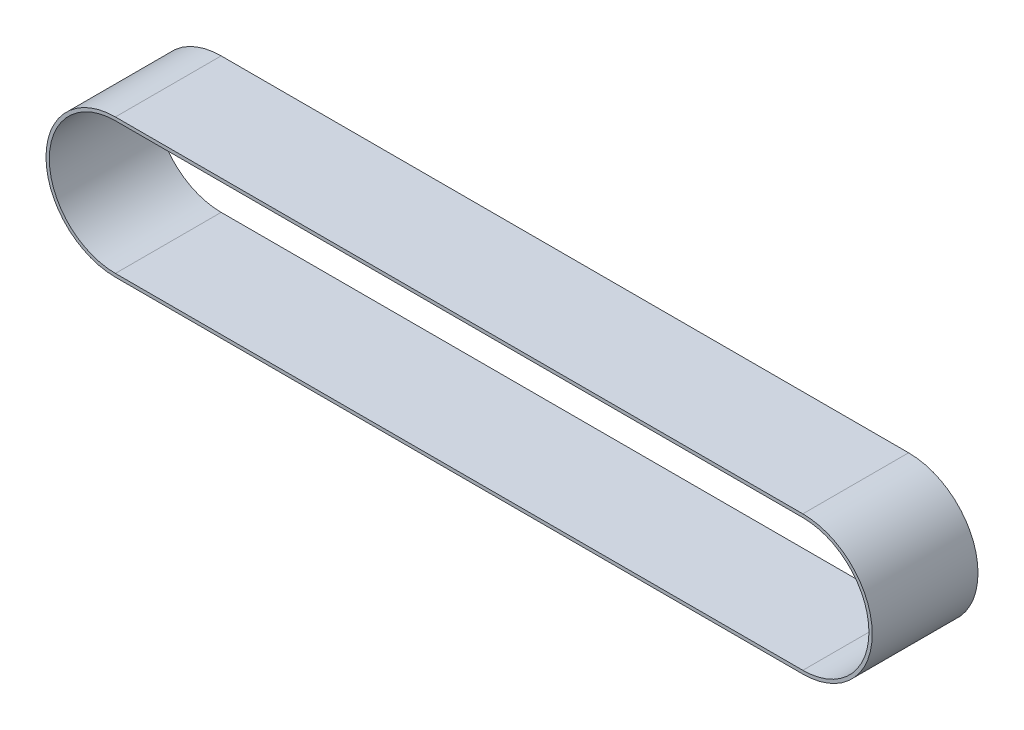
ISO-10303-21;
HEADER;
FILE_DESCRIPTION(('STEP AP214'),'2;1');
FILE_NAME('part.step','',(''),(''),'','','');
FILE_SCHEMA(('AUTOMOTIVE_DESIGN { 1 0 10303 214 1 1 1 1 }'));
ENDSEC;
DATA;
#1=APPLICATION_CONTEXT('core data for automotive mechanical design processes');
#2=APPLICATION_PROTOCOL_DEFINITION('international standard','automotive_design',2000,#1);
#3=PRODUCT_CONTEXT('',#1,'mechanical');
#4=PRODUCT('Part','Part','',(#3));
#5=PRODUCT_RELATED_PRODUCT_CATEGORY('part','',(#4));
#6=PRODUCT_DEFINITION_FORMATION('','',#4);
#7=PRODUCT_DEFINITION_CONTEXT('part definition',#1,'design');
#8=PRODUCT_DEFINITION('design','',#6,#7);
#9=PRODUCT_DEFINITION_SHAPE('','',#8);
#10=(LENGTH_UNIT() NAMED_UNIT(*) SI_UNIT(.MILLI.,.METRE.));
#11=(NAMED_UNIT(*) PLANE_ANGLE_UNIT() SI_UNIT($,.RADIAN.));
#12=(NAMED_UNIT(*) SI_UNIT($,.STERADIAN.) SOLID_ANGLE_UNIT());
#13=UNCERTAINTY_MEASURE_WITH_UNIT(LENGTH_MEASURE(1.E-05),#10,'distance_accuracy_value','');
#14=(GEOMETRIC_REPRESENTATION_CONTEXT(3) GLOBAL_UNCERTAINTY_ASSIGNED_CONTEXT((#13)) GLOBAL_UNIT_ASSIGNED_CONTEXT((#10,
#11,#12)) REPRESENTATION_CONTEXT('',''));
#15=CARTESIAN_POINT('',(0.,0.,0.));
#16=DIRECTION('',(0.,0.,1.));
#17=DIRECTION('',(1.,0.,0.));
#18=AXIS2_PLACEMENT_3D('',#15,#16,#17);
#19=CARTESIAN_POINT('',(0.,0.,50.8));
#20=DIRECTION('',(0.,0.,1.));
#21=DIRECTION('',(1.,0.,0.));
#22=AXIS2_PLACEMENT_3D('',#19,#20,#21);
#23=PLANE('',#22);
#24=CARTESIAN_POINT('',(0.,0.,50.8));
#25=DIRECTION('',(0.,0.,1.));
#26=DIRECTION('',(1.,0.,0.));
#27=AXIS2_PLACEMENT_3D('',#24,#25,#26);
#28=CIRCLE('',#27,33.3375);
#29=CARTESIAN_POINT('',(0.,33.3375,50.8));
#30=VERTEX_POINT('',#29);
#31=CARTESIAN_POINT('',(0.,-33.3375,50.8));
#32=VERTEX_POINT('',#31);
#33=EDGE_CURVE('E134',#30,#32,#28,.T.);
#34=ORIENTED_EDGE('',*,*,#33,.T.);
#35=DIRECTION('',(1.,0.,0.));
#36=VECTOR('',#35,1.);
#37=CARTESIAN_POINT('',(0.,-33.3375,50.8));
#38=LINE('',#37,#36);
#39=CARTESIAN_POINT('',(330.2,-33.3375,50.8));
#40=VERTEX_POINT('',#39);
#41=EDGE_CURVE('E137',#32,#40,#38,.T.);
#42=ORIENTED_EDGE('',*,*,#41,.T.);
#43=CARTESIAN_POINT('',(330.2,0.,50.8));
#44=DIRECTION('',(0.,0.,1.));
#45=DIRECTION('',(1.,0.,0.));
#46=AXIS2_PLACEMENT_3D('',#43,#44,#45);
#47=CIRCLE('',#46,33.3375);
#48=CARTESIAN_POINT('',(330.2,33.3375,50.8));
#49=VERTEX_POINT('',#48);
#50=EDGE_CURVE('E140',#40,#49,#47,.T.);
#51=ORIENTED_EDGE('',*,*,#50,.T.);
#52=DIRECTION('',(-1.,0.,0.));
#53=VECTOR('',#52,1.);
#54=CARTESIAN_POINT('',(0.,33.3375,50.8));
#55=LINE('',#54,#53);
#56=EDGE_CURVE('E142',#49,#30,#55,.T.);
#57=ORIENTED_EDGE('',*,*,#56,.T.);
#58=EDGE_LOOP('',(#34,#42,#51,#57));
#59=FACE_BOUND('',#58,.T.);
#60=DIRECTION('',(1.,0.,0.));
#61=VECTOR('',#60,1.);
#62=CARTESIAN_POINT('',(0.,-31.75,50.8));
#63=LINE('',#62,#61);
#64=CARTESIAN_POINT('',(0.,-31.75,50.8));
#65=VERTEX_POINT('',#64);
#66=CARTESIAN_POINT('',(330.2,-31.75,50.8));
#67=VERTEX_POINT('',#66);
#68=EDGE_CURVE('E106',#65,#67,#63,.T.);
#69=ORIENTED_EDGE('',*,*,#68,.F.);
#70=CARTESIAN_POINT('',(0.,0.,50.8));
#71=DIRECTION('',(0.,0.,1.));
#72=DIRECTION('',(1.,0.,0.));
#73=AXIS2_PLACEMENT_3D('',#70,#71,#72);
#74=CIRCLE('',#73,31.75);
#75=CARTESIAN_POINT('',(0.,31.75,50.8));
#76=VERTEX_POINT('',#75);
#77=EDGE_CURVE('E98',#76,#65,#74,.T.);
#78=ORIENTED_EDGE('',*,*,#77,.F.);
#79=DIRECTION('',(-1.,0.,0.));
#80=VECTOR('',#79,1.);
#81=CARTESIAN_POINT('',(0.,31.75,50.8));
#82=LINE('',#81,#80);
#83=CARTESIAN_POINT('',(330.2,31.75,50.8));
#84=VERTEX_POINT('',#83);
#85=EDGE_CURVE('E120',#84,#76,#82,.T.);
#86=ORIENTED_EDGE('',*,*,#85,.F.);
#87=CARTESIAN_POINT('',(330.2,0.,50.8));
#88=DIRECTION('',(0.,0.,1.));
#89=DIRECTION('',(1.,0.,0.));
#90=AXIS2_PLACEMENT_3D('',#87,#88,#89);
#91=CIRCLE('',#90,31.75);
#92=EDGE_CURVE('E118',#67,#84,#91,.T.);
#93=ORIENTED_EDGE('',*,*,#92,.F.);
#94=EDGE_LOOP('',(#69,#78,#86,#93));
#95=FACE_BOUND('',#94,.T.);
#96=ADVANCED_FACE('F33',(#59,#95),#23,.T.);
#97=CARTESIAN_POINT('',(0.,0.,0.));
#98=DIRECTION('',(0.,0.,1.));
#99=DIRECTION('',(1.,0.,0.));
#100=AXIS2_PLACEMENT_3D('',#97,#98,#99);
#101=PLANE('',#100);
#102=CARTESIAN_POINT('',(0.,0.,0.));
#103=DIRECTION('',(0.,0.,1.));
#104=DIRECTION('',(1.,0.,0.));
#105=AXIS2_PLACEMENT_3D('',#102,#103,#104);
#106=CIRCLE('',#105,33.3375);
#107=CARTESIAN_POINT('',(0.,33.3375,0.));
#108=VERTEX_POINT('',#107);
#109=CARTESIAN_POINT('',(0.,-33.3375,0.));
#110=VERTEX_POINT('',#109);
#111=EDGE_CURVE('E114',#108,#110,#106,.T.);
#112=ORIENTED_EDGE('',*,*,#111,.F.);
#113=DIRECTION('',(-1.,0.,0.));
#114=VECTOR('',#113,1.);
#115=CARTESIAN_POINT('',(0.,33.3375,0.));
#116=LINE('',#115,#114);
#117=CARTESIAN_POINT('',(330.2,33.3375,0.));
#118=VERTEX_POINT('',#117);
#119=EDGE_CURVE('E138',#118,#108,#116,.T.);
#120=ORIENTED_EDGE('',*,*,#119,.F.);
#121=CARTESIAN_POINT('',(330.2,0.,0.));
#122=DIRECTION('',(0.,0.,1.));
#123=DIRECTION('',(1.,0.,0.));
#124=AXIS2_PLACEMENT_3D('',#121,#122,#123);
#125=CIRCLE('',#124,33.3375);
#126=CARTESIAN_POINT('',(330.2,-33.3375,0.));
#127=VERTEX_POINT('',#126);
#128=EDGE_CURVE('E149',#127,#118,#125,.T.);
#129=ORIENTED_EDGE('',*,*,#128,.F.);
#130=DIRECTION('',(1.,0.,0.));
#131=VECTOR('',#130,1.);
#132=CARTESIAN_POINT('',(0.,-33.3375,0.));
#133=LINE('',#132,#131);
#134=EDGE_CURVE('E147',#110,#127,#133,.T.);
#135=ORIENTED_EDGE('',*,*,#134,.F.);
#136=EDGE_LOOP('',(#112,#120,#129,#135));
#137=FACE_BOUND('',#136,.T.);
#138=CARTESIAN_POINT('',(0.,0.,0.));
#139=DIRECTION('',(0.,0.,1.));
#140=DIRECTION('',(1.,0.,0.));
#141=AXIS2_PLACEMENT_3D('',#138,#139,#140);
#142=CIRCLE('',#141,31.75);
#143=CARTESIAN_POINT('',(0.,31.75,0.));
#144=VERTEX_POINT('',#143);
#145=CARTESIAN_POINT('',(0.,-31.75,0.));
#146=VERTEX_POINT('',#145);
#147=EDGE_CURVE('E56',#144,#146,#142,.T.);
#148=ORIENTED_EDGE('',*,*,#147,.T.);
#149=DIRECTION('',(1.,0.,0.));
#150=VECTOR('',#149,1.);
#151=CARTESIAN_POINT('',(0.,-31.75,0.));
#152=LINE('',#151,#150);
#153=CARTESIAN_POINT('',(330.2,-31.75,0.));
#154=VERTEX_POINT('',#153);
#155=EDGE_CURVE('E113',#146,#154,#152,.T.);
#156=ORIENTED_EDGE('',*,*,#155,.T.);
#157=CARTESIAN_POINT('',(330.2,0.,0.));
#158=DIRECTION('',(0.,0.,1.));
#159=DIRECTION('',(1.,0.,0.));
#160=AXIS2_PLACEMENT_3D('',#157,#158,#159);
#161=CIRCLE('',#160,31.75);
#162=CARTESIAN_POINT('',(330.2,31.75,0.));
#163=VERTEX_POINT('',#162);
#164=EDGE_CURVE('E126',#154,#163,#161,.T.);
#165=ORIENTED_EDGE('',*,*,#164,.T.);
#166=DIRECTION('',(-1.,0.,0.));
#167=VECTOR('',#166,1.);
#168=CARTESIAN_POINT('',(0.,31.75,0.));
#169=LINE('',#168,#167);
#170=EDGE_CURVE('E107',#163,#144,#169,.T.);
#171=ORIENTED_EDGE('',*,*,#170,.T.);
#172=EDGE_LOOP('',(#148,#156,#165,#171));
#173=FACE_BOUND('',#172,.T.);
#174=ADVANCED_FACE('F167',(#137,#173),#101,.F.);
#175=CARTESIAN_POINT('',(0.,0.,50.8));
#176=DIRECTION('',(0.,0.,-1.));
#177=DIRECTION('',(-1.,0.,0.));
#178=AXIS2_PLACEMENT_3D('',#175,#176,#177);
#179=CYLINDRICAL_SURFACE('',#178,33.3375);
#180=ORIENTED_EDGE('',*,*,#111,.T.);
#181=DIRECTION('',(0.,0.,-1.));
#182=VECTOR('',#181,1.);
#183=CARTESIAN_POINT('',(0.,-33.3375,50.8));
#184=LINE('',#183,#182);
#185=EDGE_CURVE('E11',#32,#110,#184,.T.);
#186=ORIENTED_EDGE('',*,*,#185,.F.);
#187=ORIENTED_EDGE('',*,*,#33,.F.);
#188=DIRECTION('',(0.,0.,-1.));
#189=VECTOR('',#188,1.);
#190=CARTESIAN_POINT('',(0.,33.3375,50.8));
#191=LINE('',#190,#189);
#192=EDGE_CURVE('E144',#30,#108,#191,.T.);
#193=ORIENTED_EDGE('',*,*,#192,.T.);
#194=EDGE_LOOP('',(#180,#186,#187,#193));
#195=FACE_BOUND('',#194,.T.);
#196=ADVANCED_FACE('F35',(#195),#179,.T.);
#197=CARTESIAN_POINT('',(0.,-33.3375,50.8));
#198=DIRECTION('',(0.,1.,0.));
#199=DIRECTION('',(0.,0.,1.));
#200=AXIS2_PLACEMENT_3D('',#197,#198,#199);
#201=PLANE('',#200);
#202=ORIENTED_EDGE('',*,*,#134,.T.);
#203=DIRECTION('',(0.,0.,-1.));
#204=VECTOR('',#203,1.);
#205=CARTESIAN_POINT('',(330.2,-33.3375,50.8));
#206=LINE('',#205,#204);
#207=EDGE_CURVE('E41',#40,#127,#206,.T.);
#208=ORIENTED_EDGE('',*,*,#207,.F.);
#209=ORIENTED_EDGE('',*,*,#41,.F.);
#210=ORIENTED_EDGE('',*,*,#185,.T.);
#211=EDGE_LOOP('',(#202,#208,#209,#210));
#212=FACE_BOUND('',#211,.T.);
#213=ADVANCED_FACE('F177',(#212),#201,.F.);
#214=CARTESIAN_POINT('',(330.2,0.,50.8));
#215=DIRECTION('',(0.,0.,-1.));
#216=DIRECTION('',(-1.,0.,0.));
#217=AXIS2_PLACEMENT_3D('',#214,#215,#216);
#218=CYLINDRICAL_SURFACE('',#217,33.3375);
#219=ORIENTED_EDGE('',*,*,#128,.T.);
#220=DIRECTION('',(0.,0.,-1.));
#221=VECTOR('',#220,1.);
#222=CARTESIAN_POINT('',(330.2,33.3375,50.8));
#223=LINE('',#222,#221);
#224=EDGE_CURVE('E154',#49,#118,#223,.T.);
#225=ORIENTED_EDGE('',*,*,#224,.F.);
#226=ORIENTED_EDGE('',*,*,#50,.F.);
#227=ORIENTED_EDGE('',*,*,#207,.T.);
#228=EDGE_LOOP('',(#219,#225,#226,#227));
#229=FACE_BOUND('',#228,.T.);
#230=ADVANCED_FACE('F161',(#229),#218,.T.);
#231=CARTESIAN_POINT('',(0.,33.3375,50.8));
#232=DIRECTION('',(0.,-1.,0.));
#233=DIRECTION('',(0.,0.,-1.));
#234=AXIS2_PLACEMENT_3D('',#231,#232,#233);
#235=PLANE('',#234);
#236=ORIENTED_EDGE('',*,*,#119,.T.);
#237=ORIENTED_EDGE('',*,*,#192,.F.);
#238=ORIENTED_EDGE('',*,*,#56,.F.);
#239=ORIENTED_EDGE('',*,*,#224,.T.);
#240=EDGE_LOOP('',(#236,#237,#238,#239));
#241=FACE_BOUND('',#240,.T.);
#242=ADVANCED_FACE('F171',(#241),#235,.F.);
#243=CARTESIAN_POINT('',(0.,0.,50.8));
#244=DIRECTION('',(0.,0.,-1.));
#245=DIRECTION('',(-1.,0.,0.));
#246=AXIS2_PLACEMENT_3D('',#243,#244,#245);
#247=CYLINDRICAL_SURFACE('',#246,31.75);
#248=ORIENTED_EDGE('',*,*,#147,.F.);
#249=DIRECTION('',(0.,0.,-1.));
#250=VECTOR('',#249,1.);
#251=CARTESIAN_POINT('',(0.,31.75,50.8));
#252=LINE('',#251,#250);
#253=EDGE_CURVE('E102',#76,#144,#252,.T.);
#254=ORIENTED_EDGE('',*,*,#253,.F.);
#255=ORIENTED_EDGE('',*,*,#77,.T.);
#256=DIRECTION('',(0.,0.,-1.));
#257=VECTOR('',#256,1.);
#258=CARTESIAN_POINT('',(0.,-31.75,50.8));
#259=LINE('',#258,#257);
#260=EDGE_CURVE('E101',#65,#146,#259,.T.);
#261=ORIENTED_EDGE('',*,*,#260,.T.);
#262=EDGE_LOOP('',(#248,#254,#255,#261));
#263=FACE_BOUND('',#262,.T.);
#264=ADVANCED_FACE('F100',(#263),#247,.F.);
#265=CARTESIAN_POINT('',(0.,-31.75,50.8));
#266=DIRECTION('',(0.,1.,0.));
#267=DIRECTION('',(0.,0.,1.));
#268=AXIS2_PLACEMENT_3D('',#265,#266,#267);
#269=PLANE('',#268);
#270=ORIENTED_EDGE('',*,*,#155,.F.);
#271=ORIENTED_EDGE('',*,*,#260,.F.);
#272=ORIENTED_EDGE('',*,*,#68,.T.);
#273=DIRECTION('',(0.,0.,-1.));
#274=VECTOR('',#273,1.);
#275=CARTESIAN_POINT('',(330.2,-31.75,50.8));
#276=LINE('',#275,#274);
#277=EDGE_CURVE('E115',#67,#154,#276,.T.);
#278=ORIENTED_EDGE('',*,*,#277,.T.);
#279=EDGE_LOOP('',(#270,#271,#272,#278));
#280=FACE_BOUND('',#279,.T.);
#281=ADVANCED_FACE('F110',(#280),#269,.T.);
#282=CARTESIAN_POINT('',(330.2,0.,50.8));
#283=DIRECTION('',(0.,0.,-1.));
#284=DIRECTION('',(-1.,0.,0.));
#285=AXIS2_PLACEMENT_3D('',#282,#283,#284);
#286=CYLINDRICAL_SURFACE('',#285,31.75);
#287=ORIENTED_EDGE('',*,*,#164,.F.);
#288=ORIENTED_EDGE('',*,*,#277,.F.);
#289=ORIENTED_EDGE('',*,*,#92,.T.);
#290=DIRECTION('',(0.,0.,-1.));
#291=VECTOR('',#290,1.);
#292=CARTESIAN_POINT('',(330.2,31.75,50.8));
#293=LINE('',#292,#291);
#294=EDGE_CURVE('E48',#84,#163,#293,.T.);
#295=ORIENTED_EDGE('',*,*,#294,.T.);
#296=EDGE_LOOP('',(#287,#288,#289,#295));
#297=FACE_BOUND('',#296,.T.);
#298=ADVANCED_FACE('F200',(#297),#286,.F.);
#299=CARTESIAN_POINT('',(0.,31.75,50.8));
#300=DIRECTION('',(0.,-1.,0.));
#301=DIRECTION('',(0.,0.,-1.));
#302=AXIS2_PLACEMENT_3D('',#299,#300,#301);
#303=PLANE('',#302);
#304=ORIENTED_EDGE('',*,*,#170,.F.);
#305=ORIENTED_EDGE('',*,*,#294,.F.);
#306=ORIENTED_EDGE('',*,*,#85,.T.);
#307=ORIENTED_EDGE('',*,*,#253,.T.);
#308=EDGE_LOOP('',(#304,#305,#306,#307));
#309=FACE_BOUND('',#308,.T.);
#310=ADVANCED_FACE('F204',(#309),#303,.T.);
#311=CLOSED_SHELL('',(#96,#174,#196,#213,#230,#242,#264,#281,#298,#310));
#312=MANIFOLD_SOLID_BREP('B2',#311);
#313=ADVANCED_BREP_SHAPE_REPRESENTATION('',(#18,#312),#14);
#314=SHAPE_DEFINITION_REPRESENTATION(#9,#313);
ENDSEC;
END-ISO-10303-21;
